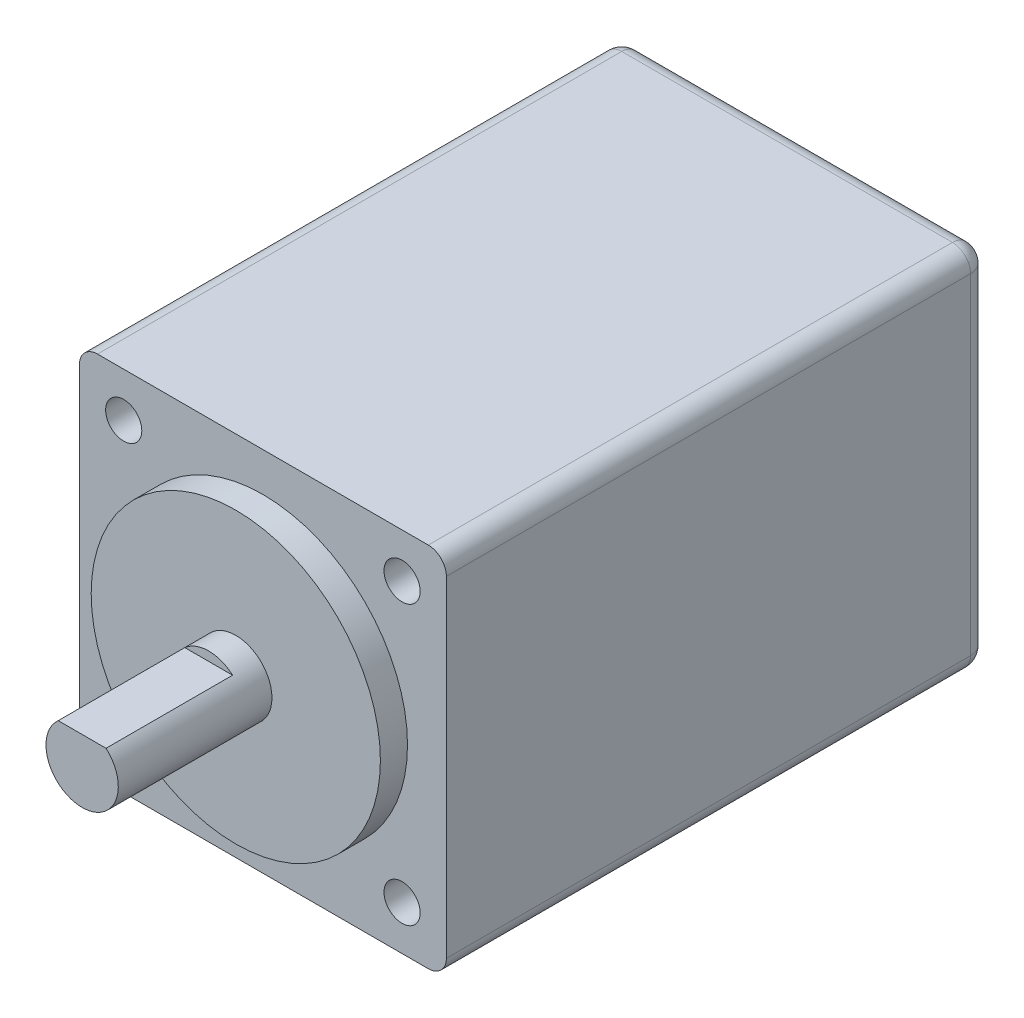
ISO-10303-21;
HEADER;
FILE_DESCRIPTION(('STEP AP214'),'2;1');
FILE_NAME('part.step','',(''),(''),'','','');
FILE_SCHEMA(('AUTOMOTIVE_DESIGN { 1 0 10303 214 1 1 1 1 }'));
ENDSEC;
DATA;
#1=APPLICATION_CONTEXT('core data for automotive mechanical design processes');
#2=APPLICATION_PROTOCOL_DEFINITION('international standard','automotive_design',2000,#1);
#3=PRODUCT_CONTEXT('',#1,'mechanical');
#4=PRODUCT('Part','Part','',(#3));
#5=PRODUCT_RELATED_PRODUCT_CATEGORY('part','',(#4));
#6=PRODUCT_DEFINITION_FORMATION('','',#4);
#7=PRODUCT_DEFINITION_CONTEXT('part definition',#1,'design');
#8=PRODUCT_DEFINITION('design','',#6,#7);
#9=PRODUCT_DEFINITION_SHAPE('','',#8);
#10=(LENGTH_UNIT() NAMED_UNIT(*) SI_UNIT(.MILLI.,.METRE.));
#11=(NAMED_UNIT(*) PLANE_ANGLE_UNIT() SI_UNIT($,.RADIAN.));
#12=(NAMED_UNIT(*) SI_UNIT($,.STERADIAN.) SOLID_ANGLE_UNIT());
#13=UNCERTAINTY_MEASURE_WITH_UNIT(LENGTH_MEASURE(1.E-05),#10,'distance_accuracy_value','');
#14=(GEOMETRIC_REPRESENTATION_CONTEXT(3) GLOBAL_UNCERTAINTY_ASSIGNED_CONTEXT((#13)) GLOBAL_UNIT_ASSIGNED_CONTEXT((#10,
#11,#12)) REPRESENTATION_CONTEXT('',''));
#15=CARTESIAN_POINT('',(0.,0.,0.));
#16=DIRECTION('',(0.,0.,1.));
#17=DIRECTION('',(1.,0.,0.));
#18=AXIS2_PLACEMENT_3D('',#15,#16,#17);
#19=CARTESIAN_POINT('',(0.,0.,31.5));
#20=DIRECTION('',(0.,0.,1.));
#21=DIRECTION('',(1.,0.,0.));
#22=AXIS2_PLACEMENT_3D('',#19,#20,#21);
#23=PLANE('',#22);
#24=CARTESIAN_POINT('',(0.,0.,31.5));
#25=DIRECTION('',(0.,0.,1.));
#26=DIRECTION('',(1.,0.,0.));
#27=AXIS2_PLACEMENT_3D('',#24,#25,#26);
#28=CIRCLE('',#27,8.);
#29=CARTESIAN_POINT('',(8.,0.,31.5));
#30=VERTEX_POINT('',#29);
#31=EDGE_CURVE('E144',#30,#30,#28,.T.);
#32=ORIENTED_EDGE('',*,*,#31,.T.);
#33=EDGE_LOOP('',(#32));
#34=FACE_BOUND('',#33,.T.);
#35=CARTESIAN_POINT('',(0.,0.,31.5));
#36=DIRECTION('',(0.,0.,1.));
#37=DIRECTION('',(1.,0.,0.));
#38=AXIS2_PLACEMENT_3D('',#35,#36,#37);
#39=CIRCLE('',#38,2.);
#40=CARTESIAN_POINT('',(2.,0.,31.5));
#41=VERTEX_POINT('',#40);
#42=EDGE_CURVE('E145',#41,#41,#39,.T.);
#43=ORIENTED_EDGE('',*,*,#42,.F.);
#44=EDGE_LOOP('',(#43));
#45=FACE_BOUND('',#44,.T.);
#46=ADVANCED_FACE('F33',(#34,#45),#23,.T.);
#47=CARTESIAN_POINT('',(10.15,10.15,30.));
#48=DIRECTION('',(0.,0.,-1.));
#49=DIRECTION('',(-1.,0.,0.));
#50=AXIS2_PLACEMENT_3D('',#47,#48,#49);
#51=PLANE('',#50);
#52=CARTESIAN_POINT('',(-7.69999999999969,-7.7,30.));
#53=DIRECTION('',(0.,0.,1.));
#54=DIRECTION('',(1.,0.,0.));
#55=AXIS2_PLACEMENT_3D('',#52,#53,#54);
#56=CIRCLE('',#55,1.);
#57=CARTESIAN_POINT('',(-6.69999999999969,-7.7,30.));
#58=VERTEX_POINT('',#57);
#59=EDGE_CURVE('E237',#58,#58,#56,.T.);
#60=ORIENTED_EDGE('',*,*,#59,.F.);
#61=EDGE_LOOP('',(#60));
#62=FACE_BOUND('',#61,.T.);
#63=CARTESIAN_POINT('',(7.70000000000031,-7.69999999999969,30.));
#64=DIRECTION('',(0.,0.,1.));
#65=DIRECTION('',(1.,0.,0.));
#66=AXIS2_PLACEMENT_3D('',#63,#64,#65);
#67=CIRCLE('',#66,1.);
#68=CARTESIAN_POINT('',(8.70000000000032,-7.69999999999969,30.));
#69=VERTEX_POINT('',#68);
#70=EDGE_CURVE('E245',#69,#69,#67,.T.);
#71=ORIENTED_EDGE('',*,*,#70,.F.);
#72=EDGE_LOOP('',(#71));
#73=FACE_BOUND('',#72,.T.);
#74=CARTESIAN_POINT('',(7.7,7.70000000000031,30.));
#75=DIRECTION('',(0.,0.,1.));
#76=DIRECTION('',(1.,0.,0.));
#77=AXIS2_PLACEMENT_3D('',#74,#75,#76);
#78=CIRCLE('',#77,1.);
#79=CARTESIAN_POINT('',(8.7,7.70000000000031,30.));
#80=VERTEX_POINT('',#79);
#81=EDGE_CURVE('E251',#80,#80,#78,.T.);
#82=ORIENTED_EDGE('',*,*,#81,.F.);
#83=EDGE_LOOP('',(#82));
#84=FACE_BOUND('',#83,.T.);
#85=CARTESIAN_POINT('',(-7.7,7.7,30.));
#86=DIRECTION('',(0.,0.,1.));
#87=DIRECTION('',(1.,0.,0.));
#88=AXIS2_PLACEMENT_3D('',#85,#86,#87);
#89=CIRCLE('',#88,1.);
#90=CARTESIAN_POINT('',(-6.7,7.7,30.));
#91=VERTEX_POINT('',#90);
#92=EDGE_CURVE('E257',#91,#91,#89,.T.);
#93=ORIENTED_EDGE('',*,*,#92,.F.);
#94=EDGE_LOOP('',(#93));
#95=FACE_BOUND('',#94,.T.);
#96=DIRECTION('',(0.,-1.,0.));
#97=VECTOR('',#96,1.);
#98=CARTESIAN_POINT('',(-10.15,-10.15,30.));
#99=LINE('',#98,#97);
#100=CARTESIAN_POINT('',(-10.15,9.15,30.));
#101=VERTEX_POINT('',#100);
#102=CARTESIAN_POINT('',(-10.15,-9.15,30.));
#103=VERTEX_POINT('',#102);
#104=EDGE_CURVE('E159',#101,#103,#99,.T.);
#105=ORIENTED_EDGE('',*,*,#104,.T.);
#106=CARTESIAN_POINT('',(-9.15,-9.15,30.));
#107=DIRECTION('',(0.,0.,-1.));
#108=DIRECTION('',(-1.,0.,0.));
#109=AXIS2_PLACEMENT_3D('',#106,#107,#108);
#110=CIRCLE('',#109,1.);
#111=CARTESIAN_POINT('',(-9.15,-10.15,30.));
#112=VERTEX_POINT('',#111);
#113=EDGE_CURVE('E11',#103,#112,#110,.F.);
#114=ORIENTED_EDGE('',*,*,#113,.T.);
#115=DIRECTION('',(1.,0.,0.));
#116=VECTOR('',#115,1.);
#117=CARTESIAN_POINT('',(-10.15,-10.15,30.));
#118=LINE('',#117,#116);
#119=CARTESIAN_POINT('',(9.15,-10.15,30.));
#120=VERTEX_POINT('',#119);
#121=EDGE_CURVE('E162',#112,#120,#118,.T.);
#122=ORIENTED_EDGE('',*,*,#121,.T.);
#123=CARTESIAN_POINT('',(9.15,-9.15,30.));
#124=DIRECTION('',(0.,0.,-1.));
#125=DIRECTION('',(-1.,0.,0.));
#126=AXIS2_PLACEMENT_3D('',#123,#124,#125);
#127=CIRCLE('',#126,1.);
#128=CARTESIAN_POINT('',(10.15,-9.15,30.));
#129=VERTEX_POINT('',#128);
#130=EDGE_CURVE('E42',#120,#129,#127,.F.);
#131=ORIENTED_EDGE('',*,*,#130,.T.);
#132=DIRECTION('',(0.,1.,0.));
#133=VECTOR('',#132,1.);
#134=CARTESIAN_POINT('',(10.15,-10.15,30.));
#135=LINE('',#134,#133);
#136=CARTESIAN_POINT('',(10.15,9.15,30.));
#137=VERTEX_POINT('',#136);
#138=EDGE_CURVE('E148',#129,#137,#135,.T.);
#139=ORIENTED_EDGE('',*,*,#138,.T.);
#140=CARTESIAN_POINT('',(9.15,9.15,30.));
#141=DIRECTION('',(0.,0.,-1.));
#142=DIRECTION('',(-1.,0.,0.));
#143=AXIS2_PLACEMENT_3D('',#140,#141,#142);
#144=CIRCLE('',#143,1.);
#145=CARTESIAN_POINT('',(9.15,10.15,30.));
#146=VERTEX_POINT('',#145);
#147=EDGE_CURVE('E200',#137,#146,#144,.F.);
#148=ORIENTED_EDGE('',*,*,#147,.T.);
#149=DIRECTION('',(-1.,0.,0.));
#150=VECTOR('',#149,1.);
#151=CARTESIAN_POINT('',(-10.15,10.15,30.));
#152=LINE('',#151,#150);
#153=CARTESIAN_POINT('',(-9.15,10.15,30.));
#154=VERTEX_POINT('',#153);
#155=EDGE_CURVE('E156',#146,#154,#152,.T.);
#156=ORIENTED_EDGE('',*,*,#155,.T.);
#157=CARTESIAN_POINT('',(-9.15,9.15,30.));
#158=DIRECTION('',(0.,0.,-1.));
#159=DIRECTION('',(-1.,0.,0.));
#160=AXIS2_PLACEMENT_3D('',#157,#158,#159);
#161=CIRCLE('',#160,1.);
#162=EDGE_CURVE('E202',#154,#101,#161,.F.);
#163=ORIENTED_EDGE('',*,*,#162,.T.);
#164=EDGE_LOOP('',(#105,#114,#122,#131,#139,#148,#156,#163));
#165=FACE_BOUND('',#164,.T.);
#166=CARTESIAN_POINT('',(0.,0.,30.));
#167=DIRECTION('',(0.,0.,-1.));
#168=DIRECTION('',(-1.,0.,0.));
#169=AXIS2_PLACEMENT_3D('',#166,#167,#168);
#170=CIRCLE('',#169,8.);
#171=CARTESIAN_POINT('',(-8.,0.,30.));
#172=VERTEX_POINT('',#171);
#173=EDGE_CURVE('E134',#172,#172,#170,.F.);
#174=ORIENTED_EDGE('',*,*,#173,.F.);
#175=EDGE_LOOP('',(#174));
#176=FACE_BOUND('',#175,.T.);
#177=ADVANCED_FACE('F278',(#62,#73,#84,#95,#165,#176),#51,.F.);
#178=CARTESIAN_POINT('',(10.15,-10.15,30.));
#179=DIRECTION('',(-1.,0.,0.));
#180=DIRECTION('',(0.,0.,1.));
#181=AXIS2_PLACEMENT_3D('',#178,#179,#180);
#182=PLANE('',#181);
#183=ORIENTED_EDGE('',*,*,#138,.F.);
#184=DIRECTION('',(0.,0.,-1.));
#185=VECTOR('',#184,1.);
#186=CARTESIAN_POINT('',(10.15,-9.15,30.));
#187=LINE('',#186,#185);
#188=CARTESIAN_POINT('',(10.15,-9.15,1.));
#189=VERTEX_POINT('',#188);
#190=EDGE_CURVE('E50',#129,#189,#187,.T.);
#191=ORIENTED_EDGE('',*,*,#190,.T.);
#192=DIRECTION('',(0.,1.,0.));
#193=VECTOR('',#192,1.);
#194=CARTESIAN_POINT('',(10.15,10.15,1.));
#195=LINE('',#194,#193);
#196=CARTESIAN_POINT('',(10.15,9.15,1.));
#197=VERTEX_POINT('',#196);
#198=EDGE_CURVE('E55',#189,#197,#195,.T.);
#199=ORIENTED_EDGE('',*,*,#198,.T.);
#200=DIRECTION('',(0.,0.,-1.));
#201=VECTOR('',#200,1.);
#202=CARTESIAN_POINT('',(10.15,9.15,30.));
#203=LINE('',#202,#201);
#204=EDGE_CURVE('E196',#197,#137,#203,.F.);
#205=ORIENTED_EDGE('',*,*,#204,.T.);
#206=EDGE_LOOP('',(#183,#191,#199,#205));
#207=FACE_BOUND('',#206,.T.);
#208=ADVANCED_FACE('F284',(#207),#182,.F.);
#209=CARTESIAN_POINT('',(-10.15,10.15,30.));
#210=DIRECTION('',(0.,-1.,0.));
#211=DIRECTION('',(0.,0.,-1.));
#212=AXIS2_PLACEMENT_3D('',#209,#210,#211);
#213=PLANE('',#212);
#214=DIRECTION('',(-1.,0.,0.));
#215=VECTOR('',#214,1.);
#216=CARTESIAN_POINT('',(-10.15,10.15,1.));
#217=LINE('',#216,#215);
#218=CARTESIAN_POINT('',(9.15,10.15,1.));
#219=VERTEX_POINT('',#218);
#220=CARTESIAN_POINT('',(-9.15,10.15,1.));
#221=VERTEX_POINT('',#220);
#222=EDGE_CURVE('E170',#219,#221,#217,.T.);
#223=ORIENTED_EDGE('',*,*,#222,.T.);
#224=DIRECTION('',(0.,0.,-1.));
#225=VECTOR('',#224,1.);
#226=CARTESIAN_POINT('',(-9.15,10.15,30.));
#227=LINE('',#226,#225);
#228=EDGE_CURVE('E173',#221,#154,#227,.F.);
#229=ORIENTED_EDGE('',*,*,#228,.T.);
#230=ORIENTED_EDGE('',*,*,#155,.F.);
#231=DIRECTION('',(0.,0.,-1.));
#232=VECTOR('',#231,1.);
#233=CARTESIAN_POINT('',(9.15,10.15,30.));
#234=LINE('',#233,#232);
#235=EDGE_CURVE('E168',#146,#219,#234,.T.);
#236=ORIENTED_EDGE('',*,*,#235,.T.);
#237=EDGE_LOOP('',(#223,#229,#230,#236));
#238=FACE_BOUND('',#237,.T.);
#239=ADVANCED_FACE('F305',(#238),#213,.F.);
#240=CARTESIAN_POINT('',(-10.15,-10.15,30.));
#241=DIRECTION('',(1.,0.,0.));
#242=DIRECTION('',(0.,0.,-1.));
#243=AXIS2_PLACEMENT_3D('',#240,#241,#242);
#244=PLANE('',#243);
#245=DIRECTION('',(0.,-1.,0.));
#246=VECTOR('',#245,1.);
#247=CARTESIAN_POINT('',(-10.15,-10.15,1.));
#248=LINE('',#247,#246);
#249=CARTESIAN_POINT('',(-10.15,9.15,1.));
#250=VERTEX_POINT('',#249);
#251=CARTESIAN_POINT('',(-10.15,-9.15,1.));
#252=VERTEX_POINT('',#251);
#253=EDGE_CURVE('E186',#250,#252,#248,.T.);
#254=ORIENTED_EDGE('',*,*,#253,.T.);
#255=DIRECTION('',(0.,0.,-1.));
#256=VECTOR('',#255,1.);
#257=CARTESIAN_POINT('',(-10.15,-9.15,30.));
#258=LINE('',#257,#256);
#259=EDGE_CURVE('E188',#252,#103,#258,.F.);
#260=ORIENTED_EDGE('',*,*,#259,.T.);
#261=ORIENTED_EDGE('',*,*,#104,.F.);
#262=DIRECTION('',(0.,0.,-1.));
#263=VECTOR('',#262,1.);
#264=CARTESIAN_POINT('',(-10.15,9.15,30.));
#265=LINE('',#264,#263);
#266=EDGE_CURVE('E184',#101,#250,#265,.T.);
#267=ORIENTED_EDGE('',*,*,#266,.T.);
#268=EDGE_LOOP('',(#254,#260,#261,#267));
#269=FACE_BOUND('',#268,.T.);
#270=ADVANCED_FACE('F301',(#269),#244,.F.);
#271=CARTESIAN_POINT('',(-10.15,-10.15,30.));
#272=DIRECTION('',(0.,1.,0.));
#273=DIRECTION('',(0.,0.,1.));
#274=AXIS2_PLACEMENT_3D('',#271,#272,#273);
#275=PLANE('',#274);
#276=ORIENTED_EDGE('',*,*,#121,.F.);
#277=DIRECTION('',(0.,0.,-1.));
#278=VECTOR('',#277,1.);
#279=CARTESIAN_POINT('',(-9.15,-10.15,30.));
#280=LINE('',#279,#278);
#281=CARTESIAN_POINT('',(-9.15,-10.15,1.));
#282=VERTEX_POINT('',#281);
#283=EDGE_CURVE('E194',#112,#282,#280,.T.);
#284=ORIENTED_EDGE('',*,*,#283,.T.);
#285=DIRECTION('',(1.,0.,0.));
#286=VECTOR('',#285,1.);
#287=CARTESIAN_POINT('',(10.15,-10.15,1.));
#288=LINE('',#287,#286);
#289=CARTESIAN_POINT('',(9.15,-10.15,1.));
#290=VERTEX_POINT('',#289);
#291=EDGE_CURVE('E192',#282,#290,#288,.T.);
#292=ORIENTED_EDGE('',*,*,#291,.T.);
#293=DIRECTION('',(0.,0.,-1.));
#294=VECTOR('',#293,1.);
#295=CARTESIAN_POINT('',(9.15,-10.15,30.));
#296=LINE('',#295,#294);
#297=EDGE_CURVE('E190',#290,#120,#296,.F.);
#298=ORIENTED_EDGE('',*,*,#297,.T.);
#299=EDGE_LOOP('',(#276,#284,#292,#298));
#300=FACE_BOUND('',#299,.T.);
#301=ADVANCED_FACE('F297',(#300),#275,.F.);
#302=CARTESIAN_POINT('',(10.15,10.15,0.));
#303=DIRECTION('',(0.,0.,-1.));
#304=DIRECTION('',(-1.,0.,0.));
#305=AXIS2_PLACEMENT_3D('',#302,#303,#304);
#306=PLANE('',#305);
#307=DIRECTION('',(0.,-1.,0.));
#308=VECTOR('',#307,1.);
#309=CARTESIAN_POINT('',(-9.15,10.15,0.));
#310=LINE('',#309,#308);
#311=CARTESIAN_POINT('',(-9.15,-9.15,0.));
#312=VERTEX_POINT('',#311);
#313=CARTESIAN_POINT('',(-9.15,9.15,0.));
#314=VERTEX_POINT('',#313);
#315=EDGE_CURVE('E179',#312,#314,#310,.F.);
#316=ORIENTED_EDGE('',*,*,#315,.T.);
#317=DIRECTION('',(-1.,0.,0.));
#318=VECTOR('',#317,1.);
#319=CARTESIAN_POINT('',(10.15,9.15,0.));
#320=LINE('',#319,#318);
#321=CARTESIAN_POINT('',(9.15,9.15,0.));
#322=VERTEX_POINT('',#321);
#323=EDGE_CURVE('E181',#314,#322,#320,.F.);
#324=ORIENTED_EDGE('',*,*,#323,.T.);
#325=DIRECTION('',(0.,1.,0.));
#326=VECTOR('',#325,1.);
#327=CARTESIAN_POINT('',(9.15,-10.15,0.));
#328=LINE('',#327,#326);
#329=CARTESIAN_POINT('',(9.15,-9.15,0.));
#330=VERTEX_POINT('',#329);
#331=EDGE_CURVE('E175',#322,#330,#328,.F.);
#332=ORIENTED_EDGE('',*,*,#331,.T.);
#333=DIRECTION('',(1.,0.,0.));
#334=VECTOR('',#333,1.);
#335=CARTESIAN_POINT('',(-10.15,-9.15,0.));
#336=LINE('',#335,#334);
#337=EDGE_CURVE('E177',#330,#312,#336,.F.);
#338=ORIENTED_EDGE('',*,*,#337,.T.);
#339=EDGE_LOOP('',(#316,#324,#332,#338));
#340=FACE_BOUND('',#339,.T.);
#341=ADVANCED_FACE('F292',(#340),#306,.T.);
#342=CARTESIAN_POINT('',(0.,0.,31.5));
#343=DIRECTION('',(0.,0.,-1.));
#344=DIRECTION('',(-1.,0.,0.));
#345=AXIS2_PLACEMENT_3D('',#342,#343,#344);
#346=CYLINDRICAL_SURFACE('',#345,8.);
#347=ORIENTED_EDGE('',*,*,#31,.F.);
#348=EDGE_LOOP('',(#347));
#349=FACE_BOUND('',#348,.T.);
#350=ORIENTED_EDGE('',*,*,#173,.T.);
#351=EDGE_LOOP('',(#350));
#352=FACE_BOUND('',#351,.T.);
#353=ADVANCED_FACE('F290',(#349,#352),#346,.T.);
#354=CARTESIAN_POINT('',(0.,0.,40.));
#355=DIRECTION('',(0.,0.,-1.));
#356=DIRECTION('',(-1.,0.,0.));
#357=AXIS2_PLACEMENT_3D('',#354,#355,#356);
#358=CYLINDRICAL_SURFACE('',#357,2.);
#359=CARTESIAN_POINT('',(0.,0.,40.));
#360=DIRECTION('',(0.,0.,1.));
#361=DIRECTION('',(1.,0.,0.));
#362=AXIS2_PLACEMENT_3D('',#359,#360,#361);
#363=CIRCLE('',#362,2.);
#364=CARTESIAN_POINT('',(-1.3228756555323,1.5,40.));
#365=VERTEX_POINT('',#364);
#366=CARTESIAN_POINT('',(1.3228756555323,1.5,40.));
#367=VERTEX_POINT('',#366);
#368=EDGE_CURVE('E140',#365,#367,#363,.T.);
#369=ORIENTED_EDGE('',*,*,#368,.F.);
#370=DIRECTION('',(0.,0.,-1.));
#371=VECTOR('',#370,1.);
#372=CARTESIAN_POINT('',(-1.3228756555323,1.5,40.));
#373=LINE('',#372,#371);
#374=CARTESIAN_POINT('',(-1.3228756555323,1.5,33.));
#375=VERTEX_POINT('',#374);
#376=EDGE_CURVE('E129',#365,#375,#373,.T.);
#377=ORIENTED_EDGE('',*,*,#376,.T.);
#378=CARTESIAN_POINT('',(0.,0.,33.));
#379=DIRECTION('',(0.,0.,-1.));
#380=DIRECTION('',(-1.,0.,0.));
#381=AXIS2_PLACEMENT_3D('',#378,#379,#380);
#382=CIRCLE('',#381,2.);
#383=CARTESIAN_POINT('',(1.3228756555323,1.5,33.));
#384=VERTEX_POINT('',#383);
#385=EDGE_CURVE('E133',#375,#384,#382,.T.);
#386=ORIENTED_EDGE('',*,*,#385,.T.);
#387=DIRECTION('',(0.,0.,-1.));
#388=VECTOR('',#387,1.);
#389=CARTESIAN_POINT('',(1.3228756555323,1.5,40.));
#390=LINE('',#389,#388);
#391=EDGE_CURVE('E126',#384,#367,#390,.F.);
#392=ORIENTED_EDGE('',*,*,#391,.T.);
#393=EDGE_LOOP('',(#369,#377,#386,#392));
#394=FACE_BOUND('',#393,.T.);
#395=ORIENTED_EDGE('',*,*,#42,.T.);
#396=EDGE_LOOP('',(#395));
#397=FACE_BOUND('',#396,.T.);
#398=ADVANCED_FACE('F138',(#394,#397),#358,.T.);
#399=CARTESIAN_POINT('',(0.,0.,40.));
#400=DIRECTION('',(0.,0.,1.));
#401=DIRECTION('',(1.,0.,0.));
#402=AXIS2_PLACEMENT_3D('',#399,#400,#401);
#403=PLANE('',#402);
#404=DIRECTION('',(1.,0.,0.));
#405=VECTOR('',#404,1.);
#406=CARTESIAN_POINT('',(0.,1.5,40.));
#407=LINE('',#406,#405);
#408=EDGE_CURVE('E122',#365,#367,#407,.T.);
#409=ORIENTED_EDGE('',*,*,#408,.F.);
#410=ORIENTED_EDGE('',*,*,#368,.T.);
#411=EDGE_LOOP('',(#409,#410));
#412=FACE_BOUND('',#411,.T.);
#413=ADVANCED_FACE('F143',(#412),#403,.T.);
#414=CARTESIAN_POINT('',(-5.,2.,33.));
#415=DIRECTION('',(0.,0.,-1.));
#416=DIRECTION('',(-1.,0.,0.));
#417=AXIS2_PLACEMENT_3D('',#414,#415,#416);
#418=PLANE('',#417);
#419=DIRECTION('',(1.,0.,0.));
#420=VECTOR('',#419,1.);
#421=CARTESIAN_POINT('',(-5.,1.5,33.));
#422=LINE('',#421,#420);
#423=EDGE_CURVE('E141',#375,#384,#422,.T.);
#424=ORIENTED_EDGE('',*,*,#423,.T.);
#425=ORIENTED_EDGE('',*,*,#385,.F.);
#426=EDGE_LOOP('',(#424,#425));
#427=FACE_BOUND('',#426,.T.);
#428=ADVANCED_FACE('F266',(#427),#418,.F.);
#429=CARTESIAN_POINT('',(-5.,1.5,40.));
#430=DIRECTION('',(0.,-1.,0.));
#431=DIRECTION('',(0.,0.,-1.));
#432=AXIS2_PLACEMENT_3D('',#429,#430,#431);
#433=PLANE('',#432);
#434=ORIENTED_EDGE('',*,*,#408,.T.);
#435=ORIENTED_EDGE('',*,*,#391,.F.);
#436=ORIENTED_EDGE('',*,*,#423,.F.);
#437=ORIENTED_EDGE('',*,*,#376,.F.);
#438=EDGE_LOOP('',(#434,#435,#436,#437));
#439=FACE_BOUND('',#438,.T.);
#440=ADVANCED_FACE('F124',(#439),#433,.F.);
#441=CARTESIAN_POINT('',(-7.7,7.7,27.5));
#442=DIRECTION('',(0.,0.,1.));
#443=DIRECTION('',(1.,0.,0.));
#444=AXIS2_PLACEMENT_3D('',#441,#442,#443);
#445=CYLINDRICAL_SURFACE('',#444,1.);
#446=CARTESIAN_POINT('',(-7.7,7.7,27.5));
#447=DIRECTION('',(0.,0.,1.));
#448=DIRECTION('',(1.,0.,0.));
#449=AXIS2_PLACEMENT_3D('',#446,#447,#448);
#450=CIRCLE('',#449,1.);
#451=CARTESIAN_POINT('',(-6.7,7.7,27.5));
#452=VERTEX_POINT('',#451);
#453=EDGE_CURVE('E260',#452,#452,#450,.T.);
#454=ORIENTED_EDGE('',*,*,#453,.F.);
#455=EDGE_LOOP('',(#454));
#456=FACE_BOUND('',#455,.T.);
#457=ORIENTED_EDGE('',*,*,#92,.T.);
#458=EDGE_LOOP('',(#457));
#459=FACE_BOUND('',#458,.T.);
#460=ADVANCED_FACE('F273',(#456,#459),#445,.F.);
#461=CARTESIAN_POINT('',(-7.7,7.7,27.5));
#462=DIRECTION('',(0.,0.,1.));
#463=DIRECTION('',(1.,0.,0.));
#464=AXIS2_PLACEMENT_3D('',#461,#462,#463);
#465=PLANE('',#464);
#466=ORIENTED_EDGE('',*,*,#453,.T.);
#467=EDGE_LOOP('',(#466));
#468=FACE_BOUND('',#467,.T.);
#469=ADVANCED_FACE('F418',(#468),#465,.T.);
#470=CARTESIAN_POINT('',(7.7,7.70000000000031,27.5));
#471=DIRECTION('',(0.,0.,1.));
#472=DIRECTION('',(1.,0.,0.));
#473=AXIS2_PLACEMENT_3D('',#470,#471,#472);
#474=CYLINDRICAL_SURFACE('',#473,1.);
#475=CARTESIAN_POINT('',(7.7,7.70000000000031,27.5));
#476=DIRECTION('',(0.,0.,1.));
#477=DIRECTION('',(1.,0.,0.));
#478=AXIS2_PLACEMENT_3D('',#475,#476,#477);
#479=CIRCLE('',#478,1.);
#480=CARTESIAN_POINT('',(8.7,7.70000000000031,27.5));
#481=VERTEX_POINT('',#480);
#482=EDGE_CURVE('E254',#481,#481,#479,.T.);
#483=ORIENTED_EDGE('',*,*,#482,.F.);
#484=EDGE_LOOP('',(#483));
#485=FACE_BOUND('',#484,.T.);
#486=ORIENTED_EDGE('',*,*,#81,.T.);
#487=EDGE_LOOP('',(#486));
#488=FACE_BOUND('',#487,.T.);
#489=ADVANCED_FACE('F414',(#485,#488),#474,.F.);
#490=CARTESIAN_POINT('',(7.7,7.70000000000031,27.5));
#491=DIRECTION('',(0.,0.,1.));
#492=DIRECTION('',(1.,0.,0.));
#493=AXIS2_PLACEMENT_3D('',#490,#491,#492);
#494=PLANE('',#493);
#495=ORIENTED_EDGE('',*,*,#482,.T.);
#496=EDGE_LOOP('',(#495));
#497=FACE_BOUND('',#496,.T.);
#498=ADVANCED_FACE('F410',(#497),#494,.T.);
#499=CARTESIAN_POINT('',(7.70000000000031,-7.69999999999969,27.5));
#500=DIRECTION('',(0.,0.,1.));
#501=DIRECTION('',(1.,0.,0.));
#502=AXIS2_PLACEMENT_3D('',#499,#500,#501);
#503=CYLINDRICAL_SURFACE('',#502,1.);
#504=CARTESIAN_POINT('',(7.70000000000031,-7.69999999999969,27.5));
#505=DIRECTION('',(0.,0.,1.));
#506=DIRECTION('',(1.,0.,0.));
#507=AXIS2_PLACEMENT_3D('',#504,#505,#506);
#508=CIRCLE('',#507,1.);
#509=CARTESIAN_POINT('',(8.70000000000032,-7.69999999999969,27.5));
#510=VERTEX_POINT('',#509);
#511=EDGE_CURVE('E248',#510,#510,#508,.T.);
#512=ORIENTED_EDGE('',*,*,#511,.F.);
#513=EDGE_LOOP('',(#512));
#514=FACE_BOUND('',#513,.T.);
#515=ORIENTED_EDGE('',*,*,#70,.T.);
#516=EDGE_LOOP('',(#515));
#517=FACE_BOUND('',#516,.T.);
#518=ADVANCED_FACE('F406',(#514,#517),#503,.F.);
#519=CARTESIAN_POINT('',(7.70000000000031,-7.69999999999969,27.5));
#520=DIRECTION('',(0.,0.,1.));
#521=DIRECTION('',(1.,0.,0.));
#522=AXIS2_PLACEMENT_3D('',#519,#520,#521);
#523=PLANE('',#522);
#524=ORIENTED_EDGE('',*,*,#511,.T.);
#525=EDGE_LOOP('',(#524));
#526=FACE_BOUND('',#525,.T.);
#527=ADVANCED_FACE('F400',(#526),#523,.T.);
#528=CARTESIAN_POINT('',(-7.69999999999969,-7.7,27.5));
#529=DIRECTION('',(0.,0.,1.));
#530=DIRECTION('',(1.,0.,0.));
#531=AXIS2_PLACEMENT_3D('',#528,#529,#530);
#532=CYLINDRICAL_SURFACE('',#531,1.);
#533=CARTESIAN_POINT('',(-7.69999999999969,-7.7,27.5));
#534=DIRECTION('',(0.,0.,1.));
#535=DIRECTION('',(1.,0.,0.));
#536=AXIS2_PLACEMENT_3D('',#533,#534,#535);
#537=CIRCLE('',#536,1.);
#538=CARTESIAN_POINT('',(-6.69999999999969,-7.7,27.5));
#539=VERTEX_POINT('',#538);
#540=EDGE_CURVE('E240',#539,#539,#537,.T.);
#541=ORIENTED_EDGE('',*,*,#540,.F.);
#542=EDGE_LOOP('',(#541));
#543=FACE_BOUND('',#542,.T.);
#544=ORIENTED_EDGE('',*,*,#59,.T.);
#545=EDGE_LOOP('',(#544));
#546=FACE_BOUND('',#545,.T.);
#547=ADVANCED_FACE('F394',(#543,#546),#532,.F.);
#548=CARTESIAN_POINT('',(-7.69999999999969,-7.7,27.5));
#549=DIRECTION('',(0.,0.,1.));
#550=DIRECTION('',(1.,0.,0.));
#551=AXIS2_PLACEMENT_3D('',#548,#549,#550);
#552=PLANE('',#551);
#553=ORIENTED_EDGE('',*,*,#540,.T.);
#554=EDGE_LOOP('',(#553));
#555=FACE_BOUND('',#554,.T.);
#556=ADVANCED_FACE('F356',(#555),#552,.T.);
#557=CARTESIAN_POINT('',(9.15,-9.15,30.));
#558=DIRECTION('',(0.,0.,-1.));
#559=DIRECTION('',(-1.,0.,0.));
#560=AXIS2_PLACEMENT_3D('',#557,#558,#559);
#561=CYLINDRICAL_SURFACE('',#560,1.);
#562=ORIENTED_EDGE('',*,*,#130,.F.);
#563=ORIENTED_EDGE('',*,*,#297,.F.);
#564=CARTESIAN_POINT('',(9.15,-9.15,1.));
#565=DIRECTION('',(0.,0.,-1.));
#566=DIRECTION('',(-1.,0.,0.));
#567=AXIS2_PLACEMENT_3D('',#564,#565,#566);
#568=CIRCLE('',#567,1.);
#569=EDGE_CURVE('E232',#189,#290,#568,.T.);
#570=ORIENTED_EDGE('',*,*,#569,.F.);
#571=ORIENTED_EDGE('',*,*,#190,.F.);
#572=EDGE_LOOP('',(#562,#563,#570,#571));
#573=FACE_BOUND('',#572,.T.);
#574=ADVANCED_FACE('F35',(#573),#561,.T.);
#575=CARTESIAN_POINT('',(-9.15,-9.15,30.));
#576=DIRECTION('',(0.,0.,-1.));
#577=DIRECTION('',(-1.,0.,0.));
#578=AXIS2_PLACEMENT_3D('',#575,#576,#577);
#579=CYLINDRICAL_SURFACE('',#578,1.);
#580=ORIENTED_EDGE('',*,*,#113,.F.);
#581=ORIENTED_EDGE('',*,*,#259,.F.);
#582=CARTESIAN_POINT('',(-9.15,-9.15,1.));
#583=DIRECTION('',(0.,0.,-1.));
#584=DIRECTION('',(-1.,0.,0.));
#585=AXIS2_PLACEMENT_3D('',#582,#583,#584);
#586=CIRCLE('',#585,1.);
#587=EDGE_CURVE('E230',#282,#252,#586,.T.);
#588=ORIENTED_EDGE('',*,*,#587,.F.);
#589=ORIENTED_EDGE('',*,*,#283,.F.);
#590=EDGE_LOOP('',(#580,#581,#588,#589));
#591=FACE_BOUND('',#590,.T.);
#592=ADVANCED_FACE('F349',(#591),#579,.T.);
#593=CARTESIAN_POINT('',(-10.15,-9.15,1.));
#594=DIRECTION('',(-1.,0.,0.));
#595=DIRECTION('',(0.,0.,1.));
#596=AXIS2_PLACEMENT_3D('',#593,#594,#595);
#597=CYLINDRICAL_SURFACE('',#596,1.);
#598=CARTESIAN_POINT('',(9.15,-9.15,1.));
#599=DIRECTION('',(1.,0.,0.));
#600=DIRECTION('',(0.,0.,-1.));
#601=AXIS2_PLACEMENT_3D('',#598,#599,#600);
#602=CIRCLE('',#601,1.);
#603=EDGE_CURVE('E37',#290,#330,#602,.T.);
#604=ORIENTED_EDGE('',*,*,#603,.F.);
#605=ORIENTED_EDGE('',*,*,#291,.F.);
#606=CARTESIAN_POINT('',(-9.15,-9.15,1.));
#607=DIRECTION('',(-1.,0.,0.));
#608=DIRECTION('',(0.,0.,1.));
#609=AXIS2_PLACEMENT_3D('',#606,#607,#608);
#610=CIRCLE('',#609,1.);
#611=EDGE_CURVE('E227',#312,#282,#610,.T.);
#612=ORIENTED_EDGE('',*,*,#611,.F.);
#613=ORIENTED_EDGE('',*,*,#337,.F.);
#614=EDGE_LOOP('',(#604,#605,#612,#613));
#615=FACE_BOUND('',#614,.T.);
#616=ADVANCED_FACE('F347',(#615),#597,.T.);
#617=CARTESIAN_POINT('',(9.15,-9.15,1.));
#618=DIRECTION('',(0.,0.,1.));
#619=DIRECTION('',(1.,0.,0.));
#620=AXIS2_PLACEMENT_3D('',#617,#618,#619);
#621=SPHERICAL_SURFACE('',#620,1.);
#622=ORIENTED_EDGE('',*,*,#569,.T.);
#623=ORIENTED_EDGE('',*,*,#603,.T.);
#624=CARTESIAN_POINT('',(9.15,-9.15,1.));
#625=DIRECTION('',(0.,-1.,0.));
#626=DIRECTION('',(0.,0.,-1.));
#627=AXIS2_PLACEMENT_3D('',#624,#625,#626);
#628=CIRCLE('',#627,1.);
#629=EDGE_CURVE('E224',#189,#330,#628,.F.);
#630=ORIENTED_EDGE('',*,*,#629,.F.);
#631=EDGE_LOOP('',(#622,#623,#630));
#632=FACE_BOUND('',#631,.T.);
#633=ADVANCED_FACE('F343',(#632),#621,.T.);
#634=CARTESIAN_POINT('',(-9.15,-9.15,1.));
#635=DIRECTION('',(0.,0.,1.));
#636=DIRECTION('',(1.,0.,0.));
#637=AXIS2_PLACEMENT_3D('',#634,#635,#636);
#638=SPHERICAL_SURFACE('',#637,1.);
#639=ORIENTED_EDGE('',*,*,#611,.T.);
#640=ORIENTED_EDGE('',*,*,#587,.T.);
#641=CARTESIAN_POINT('',(-9.15,-9.15,1.));
#642=DIRECTION('',(0.,-1.,0.));
#643=DIRECTION('',(0.,0.,-1.));
#644=AXIS2_PLACEMENT_3D('',#641,#642,#643);
#645=CIRCLE('',#644,1.);
#646=EDGE_CURVE('E221',#312,#252,#645,.F.);
#647=ORIENTED_EDGE('',*,*,#646,.F.);
#648=EDGE_LOOP('',(#639,#640,#647));
#649=FACE_BOUND('',#648,.T.);
#650=ADVANCED_FACE('F339',(#649),#638,.T.);
#651=CARTESIAN_POINT('',(9.15,-10.15,1.));
#652=DIRECTION('',(0.,-1.,0.));
#653=DIRECTION('',(0.,0.,-1.));
#654=AXIS2_PLACEMENT_3D('',#651,#652,#653);
#655=CYLINDRICAL_SURFACE('',#654,1.);
#656=ORIENTED_EDGE('',*,*,#629,.T.);
#657=ORIENTED_EDGE('',*,*,#331,.F.);
#658=CARTESIAN_POINT('',(9.15,9.15,1.));
#659=DIRECTION('',(0.,1.,0.));
#660=DIRECTION('',(0.,0.,1.));
#661=AXIS2_PLACEMENT_3D('',#658,#659,#660);
#662=CIRCLE('',#661,1.);
#663=EDGE_CURVE('E218',#197,#322,#662,.T.);
#664=ORIENTED_EDGE('',*,*,#663,.F.);
#665=ORIENTED_EDGE('',*,*,#198,.F.);
#666=EDGE_LOOP('',(#656,#657,#664,#665));
#667=FACE_BOUND('',#666,.T.);
#668=ADVANCED_FACE('F335',(#667),#655,.T.);
#669=CARTESIAN_POINT('',(9.15,9.15,30.));
#670=DIRECTION('',(0.,0.,-1.));
#671=DIRECTION('',(-1.,0.,0.));
#672=AXIS2_PLACEMENT_3D('',#669,#670,#671);
#673=CYLINDRICAL_SURFACE('',#672,1.);
#674=ORIENTED_EDGE('',*,*,#147,.F.);
#675=ORIENTED_EDGE('',*,*,#204,.F.);
#676=CARTESIAN_POINT('',(9.15,9.15,1.));
#677=DIRECTION('',(0.,0.,-1.));
#678=DIRECTION('',(-1.,0.,0.));
#679=AXIS2_PLACEMENT_3D('',#676,#677,#678);
#680=CIRCLE('',#679,1.);
#681=EDGE_CURVE('E215',#219,#197,#680,.T.);
#682=ORIENTED_EDGE('',*,*,#681,.F.);
#683=ORIENTED_EDGE('',*,*,#235,.F.);
#684=EDGE_LOOP('',(#674,#675,#682,#683));
#685=FACE_BOUND('',#684,.T.);
#686=ADVANCED_FACE('F331',(#685),#673,.T.);
#687=CARTESIAN_POINT('',(-9.15,9.15,30.));
#688=DIRECTION('',(0.,0.,-1.));
#689=DIRECTION('',(-1.,0.,0.));
#690=AXIS2_PLACEMENT_3D('',#687,#688,#689);
#691=CYLINDRICAL_SURFACE('',#690,1.);
#692=ORIENTED_EDGE('',*,*,#162,.F.);
#693=ORIENTED_EDGE('',*,*,#228,.F.);
#694=CARTESIAN_POINT('',(-9.15,9.15,1.));
#695=DIRECTION('',(0.,0.,-1.));
#696=DIRECTION('',(-1.,0.,0.));
#697=AXIS2_PLACEMENT_3D('',#694,#695,#696);
#698=CIRCLE('',#697,1.);
#699=EDGE_CURVE('E212',#250,#221,#698,.T.);
#700=ORIENTED_EDGE('',*,*,#699,.F.);
#701=ORIENTED_EDGE('',*,*,#266,.F.);
#702=EDGE_LOOP('',(#692,#693,#700,#701));
#703=FACE_BOUND('',#702,.T.);
#704=ADVANCED_FACE('F327',(#703),#691,.T.);
#705=CARTESIAN_POINT('',(-9.15,-10.15,1.));
#706=DIRECTION('',(0.,1.,0.));
#707=DIRECTION('',(0.,0.,1.));
#708=AXIS2_PLACEMENT_3D('',#705,#706,#707);
#709=CYLINDRICAL_SURFACE('',#708,1.);
#710=ORIENTED_EDGE('',*,*,#646,.T.);
#711=ORIENTED_EDGE('',*,*,#253,.F.);
#712=CARTESIAN_POINT('',(-9.15,9.15,1.));
#713=DIRECTION('',(0.,1.,0.));
#714=DIRECTION('',(0.,0.,1.));
#715=AXIS2_PLACEMENT_3D('',#712,#713,#714);
#716=CIRCLE('',#715,1.);
#717=EDGE_CURVE('E209',#314,#250,#716,.T.);
#718=ORIENTED_EDGE('',*,*,#717,.F.);
#719=ORIENTED_EDGE('',*,*,#315,.F.);
#720=EDGE_LOOP('',(#710,#711,#718,#719));
#721=FACE_BOUND('',#720,.T.);
#722=ADVANCED_FACE('F323',(#721),#709,.T.);
#723=CARTESIAN_POINT('',(9.15,9.15,1.));
#724=DIRECTION('',(0.,0.,1.));
#725=DIRECTION('',(1.,0.,0.));
#726=AXIS2_PLACEMENT_3D('',#723,#724,#725);
#727=SPHERICAL_SURFACE('',#726,1.);
#728=ORIENTED_EDGE('',*,*,#681,.T.);
#729=ORIENTED_EDGE('',*,*,#663,.T.);
#730=CARTESIAN_POINT('',(9.15,9.15,1.));
#731=DIRECTION('',(1.,0.,0.));
#732=DIRECTION('',(0.,0.,-1.));
#733=AXIS2_PLACEMENT_3D('',#730,#731,#732);
#734=CIRCLE('',#733,1.);
#735=EDGE_CURVE('E207',#219,#322,#734,.F.);
#736=ORIENTED_EDGE('',*,*,#735,.F.);
#737=EDGE_LOOP('',(#728,#729,#736));
#738=FACE_BOUND('',#737,.T.);
#739=ADVANCED_FACE('F319',(#738),#727,.T.);
#740=CARTESIAN_POINT('',(-9.15,9.15,1.));
#741=DIRECTION('',(0.,0.,1.));
#742=DIRECTION('',(1.,0.,0.));
#743=AXIS2_PLACEMENT_3D('',#740,#741,#742);
#744=SPHERICAL_SURFACE('',#743,1.);
#745=ORIENTED_EDGE('',*,*,#717,.T.);
#746=ORIENTED_EDGE('',*,*,#699,.T.);
#747=CARTESIAN_POINT('',(-9.15,9.15,1.));
#748=DIRECTION('',(-1.,0.,0.));
#749=DIRECTION('',(0.,0.,1.));
#750=AXIS2_PLACEMENT_3D('',#747,#748,#749);
#751=CIRCLE('',#750,1.);
#752=EDGE_CURVE('E205',#314,#221,#751,.F.);
#753=ORIENTED_EDGE('',*,*,#752,.F.);
#754=EDGE_LOOP('',(#745,#746,#753));
#755=FACE_BOUND('',#754,.T.);
#756=ADVANCED_FACE('F315',(#755),#744,.T.);
#757=CARTESIAN_POINT('',(-10.15,9.15,1.));
#758=DIRECTION('',(1.,0.,0.));
#759=DIRECTION('',(0.,0.,-1.));
#760=AXIS2_PLACEMENT_3D('',#757,#758,#759);
#761=CYLINDRICAL_SURFACE('',#760,1.);
#762=ORIENTED_EDGE('',*,*,#735,.T.);
#763=ORIENTED_EDGE('',*,*,#323,.F.);
#764=ORIENTED_EDGE('',*,*,#752,.T.);
#765=ORIENTED_EDGE('',*,*,#222,.F.);
#766=EDGE_LOOP('',(#762,#763,#764,#765));
#767=FACE_BOUND('',#766,.T.);
#768=ADVANCED_FACE('F312',(#767),#761,.T.);
#769=CLOSED_SHELL('',(#46,#177,#208,#239,#270,#301,#341,#353,#398,#413,#428,#440,#460,#469,#489,
#498,#518,#527,#547,#556,#574,#592,#616,#633,#650,#668,#686,#704,#722,#739,#756,#768));
#770=MANIFOLD_SOLID_BREP('B2',#769);
#771=ADVANCED_BREP_SHAPE_REPRESENTATION('',(#18,#770),#14);
#772=SHAPE_DEFINITION_REPRESENTATION(#9,#771);
ENDSEC;
END-ISO-10303-21;
